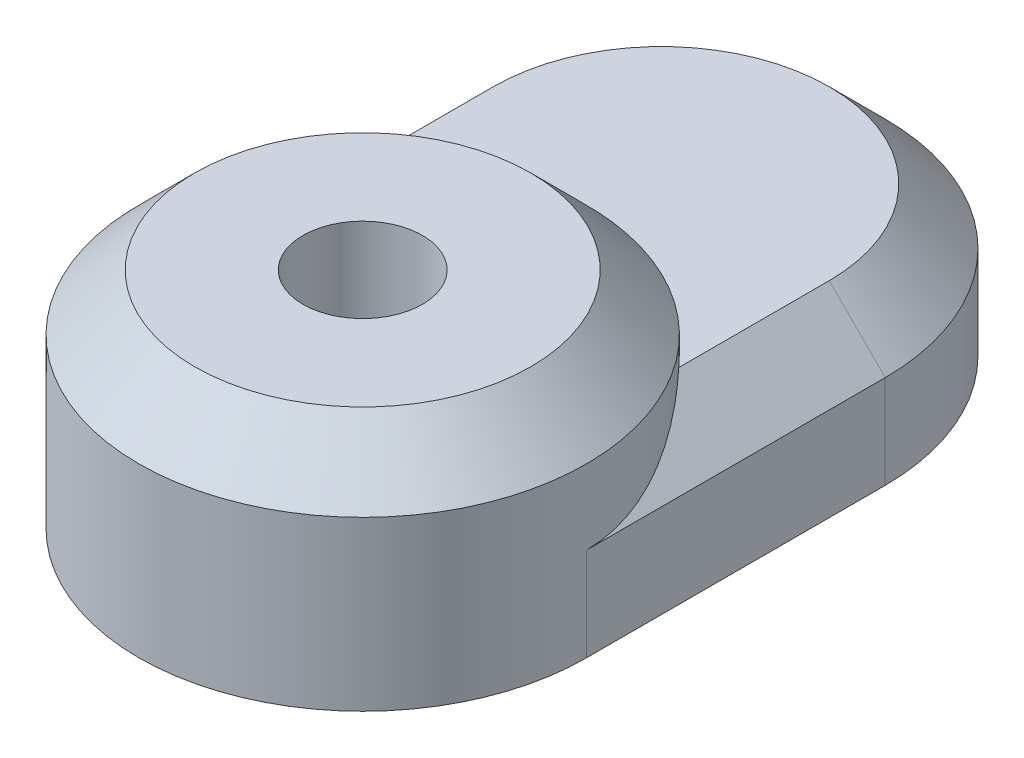
ISO-10303-21;
HEADER;
FILE_DESCRIPTION(('STEP AP214'),'2;1');
FILE_NAME('part.step','',(''),(''),'','','');
FILE_SCHEMA(('AUTOMOTIVE_DESIGN { 1 0 10303 214 1 1 1 1 }'));
ENDSEC;
DATA;
#1=APPLICATION_CONTEXT('core data for automotive mechanical design processes');
#2=APPLICATION_PROTOCOL_DEFINITION('international standard','automotive_design',2000,#1);
#3=PRODUCT_CONTEXT('',#1,'mechanical');
#4=PRODUCT('Part','Part','',(#3));
#5=PRODUCT_RELATED_PRODUCT_CATEGORY('part','',(#4));
#6=PRODUCT_DEFINITION_FORMATION('','',#4);
#7=PRODUCT_DEFINITION_CONTEXT('part definition',#1,'design');
#8=PRODUCT_DEFINITION('design','',#6,#7);
#9=PRODUCT_DEFINITION_SHAPE('','',#8);
#10=(LENGTH_UNIT() NAMED_UNIT(*) SI_UNIT(.MILLI.,.METRE.));
#11=(NAMED_UNIT(*) PLANE_ANGLE_UNIT() SI_UNIT($,.RADIAN.));
#12=(NAMED_UNIT(*) SI_UNIT($,.STERADIAN.) SOLID_ANGLE_UNIT());
#13=UNCERTAINTY_MEASURE_WITH_UNIT(LENGTH_MEASURE(1.E-05),#10,'distance_accuracy_value','');
#14=(GEOMETRIC_REPRESENTATION_CONTEXT(3) GLOBAL_UNCERTAINTY_ASSIGNED_CONTEXT((#13)) GLOBAL_UNIT_ASSIGNED_CONTEXT((#10,
#11,#12)) REPRESENTATION_CONTEXT('',''));
#15=CARTESIAN_POINT('',(0.,0.,0.));
#16=DIRECTION('',(0.,0.,1.));
#17=DIRECTION('',(1.,0.,0.));
#18=AXIS2_PLACEMENT_3D('',#15,#16,#17);
#19=CARTESIAN_POINT('',(0.,4.,0.));
#20=DIRECTION('',(0.,1.,0.));
#21=DIRECTION('',(0.,0.,1.));
#22=AXIS2_PLACEMENT_3D('',#19,#20,#21);
#23=PLANE('',#22);
#24=CARTESIAN_POINT('',(0.,4.,0.));
#25=DIRECTION('',(0.,1.,0.));
#26=DIRECTION('',(0.,0.,1.));
#27=AXIS2_PLACEMENT_3D('',#24,#25,#26);
#28=CIRCLE('',#27,6.);
#29=CARTESIAN_POINT('',(4.5,4.,-3.96862696659688));
#30=VERTEX_POINT('',#29);
#31=CARTESIAN_POINT('',(-4.5,4.,-3.96862696659688));
#32=VERTEX_POINT('',#31);
#33=EDGE_CURVE('E118',#30,#32,#28,.T.);
#34=ORIENTED_EDGE('',*,*,#33,.F.);
#35=DIRECTION('',(0.,0.,-1.));
#36=VECTOR('',#35,1.);
#37=CARTESIAN_POINT('',(4.5,4.,-8.));
#38=LINE('',#37,#36);
#39=CARTESIAN_POINT('',(4.5,4.,-8.));
#40=VERTEX_POINT('',#39);
#41=EDGE_CURVE('E152',#30,#40,#38,.T.);
#42=ORIENTED_EDGE('',*,*,#41,.T.);
#43=CARTESIAN_POINT('',(0.,4.,-8.));
#44=DIRECTION('',(0.,1.,0.));
#45=DIRECTION('',(0.,0.,1.));
#46=AXIS2_PLACEMENT_3D('',#43,#44,#45);
#47=CIRCLE('',#46,4.5);
#48=CARTESIAN_POINT('',(-4.5,4.,-8.));
#49=VERTEX_POINT('',#48);
#50=EDGE_CURVE('E148',#40,#49,#47,.T.);
#51=ORIENTED_EDGE('',*,*,#50,.T.);
#52=DIRECTION('',(0.,0.,1.));
#53=VECTOR('',#52,1.);
#54=CARTESIAN_POINT('',(-4.5,4.,0.));
#55=LINE('',#54,#53);
#56=EDGE_CURVE('E145',#49,#32,#55,.T.);
#57=ORIENTED_EDGE('',*,*,#56,.T.);
#58=EDGE_LOOP('',(#34,#42,#51,#57));
#59=FACE_BOUND('',#58,.T.);
#60=ADVANCED_FACE('F35',(#59),#23,.T.);
#61=CARTESIAN_POINT('',(0.,0.,0.));
#62=DIRECTION('',(0.,1.,0.));
#63=DIRECTION('',(0.,0.,1.));
#64=AXIS2_PLACEMENT_3D('',#61,#62,#63);
#65=PLANE('',#64);
#66=CARTESIAN_POINT('',(0.,0.,0.));
#67=DIRECTION('',(0.,1.,0.));
#68=DIRECTION('',(0.,0.,1.));
#69=AXIS2_PLACEMENT_3D('',#66,#67,#68);
#70=CIRCLE('',#69,6.);
#71=CARTESIAN_POINT('',(-6.,0.,0.));
#72=VERTEX_POINT('',#71);
#73=CARTESIAN_POINT('',(6.,0.,0.));
#74=VERTEX_POINT('',#73);
#75=EDGE_CURVE('E108',#72,#74,#70,.T.);
#76=ORIENTED_EDGE('',*,*,#75,.F.);
#77=DIRECTION('',(0.,0.,1.));
#78=VECTOR('',#77,1.);
#79=CARTESIAN_POINT('',(-6.,0.,0.));
#80=LINE('',#79,#78);
#81=CARTESIAN_POINT('',(-6.,0.,-8.));
#82=VERTEX_POINT('',#81);
#83=EDGE_CURVE('E123',#82,#72,#80,.T.);
#84=ORIENTED_EDGE('',*,*,#83,.F.);
#85=CARTESIAN_POINT('',(0.,0.,-8.));
#86=DIRECTION('',(0.,1.,0.));
#87=DIRECTION('',(0.,0.,1.));
#88=AXIS2_PLACEMENT_3D('',#85,#86,#87);
#89=CIRCLE('',#88,6.);
#90=CARTESIAN_POINT('',(6.,0.,-8.));
#91=VERTEX_POINT('',#90);
#92=EDGE_CURVE('E110',#91,#82,#89,.T.);
#93=ORIENTED_EDGE('',*,*,#92,.F.);
#94=DIRECTION('',(0.,0.,-1.));
#95=VECTOR('',#94,1.);
#96=CARTESIAN_POINT('',(6.,0.,0.));
#97=LINE('',#96,#95);
#98=EDGE_CURVE('E93',#74,#91,#97,.T.);
#99=ORIENTED_EDGE('',*,*,#98,.F.);
#100=EDGE_LOOP('',(#76,#84,#93,#99));
#101=FACE_BOUND('',#100,.T.);
#102=CARTESIAN_POINT('',(0.,0.,0.));
#103=DIRECTION('',(0.,1.,0.));
#104=DIRECTION('',(0.,0.,1.));
#105=AXIS2_PLACEMENT_3D('',#102,#103,#104);
#106=CIRCLE('',#105,1.6);
#107=CARTESIAN_POINT('',(0.,0.,1.6));
#108=VERTEX_POINT('',#107);
#109=EDGE_CURVE('E115',#108,#108,#106,.T.);
#110=ORIENTED_EDGE('',*,*,#109,.T.);
#111=EDGE_LOOP('',(#110));
#112=FACE_BOUND('',#111,.T.);
#113=ADVANCED_FACE('F105',(#101,#112),#65,.F.);
#114=CARTESIAN_POINT('',(0.,4.,0.));
#115=DIRECTION('',(0.,-1.,0.));
#116=DIRECTION('',(0.,0.,-1.));
#117=AXIS2_PLACEMENT_3D('',#114,#115,#116);
#118=CYLINDRICAL_SURFACE('',#117,6.);
#119=CARTESIAN_POINT('',(0.,4.5,0.));
#120=DIRECTION('',(0.,1.,0.));
#121=DIRECTION('',(0.,0.,1.));
#122=AXIS2_PLACEMENT_3D('',#119,#120,#121);
#123=CIRCLE('',#122,6.);
#124=CARTESIAN_POINT('',(0.,4.5,6.));
#125=VERTEX_POINT('',#124);
#126=EDGE_CURVE('E138',#125,#125,#123,.F.);
#127=ORIENTED_EDGE('',*,*,#126,.T.);
#128=EDGE_LOOP('',(#127));
#129=FACE_BOUND('',#128,.T.);
#130=ORIENTED_EDGE('',*,*,#75,.T.);
#131=DIRECTION('',(0.,-1.,0.));
#132=VECTOR('',#131,1.);
#133=CARTESIAN_POINT('',(6.,4.,0.));
#134=LINE('',#133,#132);
#135=CARTESIAN_POINT('',(6.,2.5,0.));
#136=VERTEX_POINT('',#135);
#137=EDGE_CURVE('E90',#136,#74,#134,.T.);
#138=ORIENTED_EDGE('',*,*,#137,.F.);
#139=CARTESIAN_POINT('',(0.,8.50000000000002,0.));
#140=DIRECTION('',(0.707106781186549,0.707106781186546,0.));
#141=DIRECTION('',(0.707106781186546,-0.707106781186549,0.));
#142=AXIS2_PLACEMENT_3D('',#139,#140,#141);
#143=ELLIPSE('',#142,8.48528137423859,6.);
#144=EDGE_CURVE('E44',#136,#30,#143,.T.);
#145=ORIENTED_EDGE('',*,*,#144,.T.);
#146=ORIENTED_EDGE('',*,*,#33,.T.);
#147=CARTESIAN_POINT('',(0.,8.50000000000002,0.));
#148=DIRECTION('',(-0.707106781186549,0.707106781186546,0.));
#149=DIRECTION('',(-0.707106781186546,-0.707106781186549,0.));
#150=AXIS2_PLACEMENT_3D('',#147,#148,#149);
#151=ELLIPSE('',#150,8.48528137423859,6.);
#152=CARTESIAN_POINT('',(-6.,2.5,0.));
#153=VERTEX_POINT('',#152);
#154=EDGE_CURVE('E11',#32,#153,#151,.T.);
#155=ORIENTED_EDGE('',*,*,#154,.T.);
#156=DIRECTION('',(0.,-1.,0.));
#157=VECTOR('',#156,1.);
#158=CARTESIAN_POINT('',(-6.,4.,0.));
#159=LINE('',#158,#157);
#160=EDGE_CURVE('E113',#153,#72,#159,.T.);
#161=ORIENTED_EDGE('',*,*,#160,.T.);
#162=EDGE_LOOP('',(#130,#138,#145,#146,#155,#161));
#163=FACE_BOUND('',#162,.T.);
#164=ADVANCED_FACE('F112',(#129,#163),#118,.T.);
#165=CARTESIAN_POINT('',(6.,4.,0.));
#166=DIRECTION('',(-1.,0.,0.));
#167=DIRECTION('',(0.,0.,1.));
#168=AXIS2_PLACEMENT_3D('',#165,#166,#167);
#169=PLANE('',#168);
#170=DIRECTION('',(0.,-1.,0.));
#171=VECTOR('',#170,1.);
#172=CARTESIAN_POINT('',(6.,4.,-8.));
#173=LINE('',#172,#171);
#174=CARTESIAN_POINT('',(6.,2.5,-8.));
#175=VERTEX_POINT('',#174);
#176=EDGE_CURVE('E101',#175,#91,#173,.T.);
#177=ORIENTED_EDGE('',*,*,#176,.F.);
#178=DIRECTION('',(0.,0.,1.));
#179=VECTOR('',#178,1.);
#180=CARTESIAN_POINT('',(6.,2.5,0.));
#181=LINE('',#180,#179);
#182=EDGE_CURVE('E96',#175,#136,#181,.T.);
#183=ORIENTED_EDGE('',*,*,#182,.T.);
#184=ORIENTED_EDGE('',*,*,#137,.T.);
#185=ORIENTED_EDGE('',*,*,#98,.T.);
#186=EDGE_LOOP('',(#177,#183,#184,#185));
#187=FACE_BOUND('',#186,.T.);
#188=ADVANCED_FACE('F92',(#187),#169,.F.);
#189=CARTESIAN_POINT('',(0.,4.,-8.));
#190=DIRECTION('',(0.,-1.,0.));
#191=DIRECTION('',(0.,0.,-1.));
#192=AXIS2_PLACEMENT_3D('',#189,#190,#191);
#193=CYLINDRICAL_SURFACE('',#192,6.);
#194=DIRECTION('',(0.,-1.,0.));
#195=VECTOR('',#194,1.);
#196=CARTESIAN_POINT('',(-6.,4.,-8.));
#197=LINE('',#196,#195);
#198=CARTESIAN_POINT('',(-6.,2.5,-8.));
#199=VERTEX_POINT('',#198);
#200=EDGE_CURVE('E125',#199,#82,#197,.T.);
#201=ORIENTED_EDGE('',*,*,#200,.F.);
#202=CARTESIAN_POINT('',(0.,2.5,-8.));
#203=DIRECTION('',(0.,1.,0.));
#204=DIRECTION('',(0.,0.,1.));
#205=AXIS2_PLACEMENT_3D('',#202,#203,#204);
#206=CIRCLE('',#205,6.);
#207=EDGE_CURVE('E59',#199,#175,#206,.F.);
#208=ORIENTED_EDGE('',*,*,#207,.T.);
#209=ORIENTED_EDGE('',*,*,#176,.T.);
#210=ORIENTED_EDGE('',*,*,#92,.T.);
#211=EDGE_LOOP('',(#201,#208,#209,#210));
#212=FACE_BOUND('',#211,.T.);
#213=ADVANCED_FACE('F195',(#212),#193,.T.);
#214=CARTESIAN_POINT('',(-6.,4.,0.));
#215=DIRECTION('',(1.,0.,0.));
#216=DIRECTION('',(0.,0.,-1.));
#217=AXIS2_PLACEMENT_3D('',#214,#215,#216);
#218=PLANE('',#217);
#219=ORIENTED_EDGE('',*,*,#160,.F.);
#220=DIRECTION('',(0.,0.,-1.));
#221=VECTOR('',#220,1.);
#222=CARTESIAN_POINT('',(-6.,2.5,-8.));
#223=LINE('',#222,#221);
#224=EDGE_CURVE('E52',#153,#199,#223,.T.);
#225=ORIENTED_EDGE('',*,*,#224,.T.);
#226=ORIENTED_EDGE('',*,*,#200,.T.);
#227=ORIENTED_EDGE('',*,*,#83,.T.);
#228=EDGE_LOOP('',(#219,#225,#226,#227));
#229=FACE_BOUND('',#228,.T.);
#230=ADVANCED_FACE('F183',(#229),#218,.F.);
#231=CARTESIAN_POINT('',(0.,4.,0.));
#232=DIRECTION('',(0.,-1.,0.));
#233=DIRECTION('',(0.,0.,-1.));
#234=AXIS2_PLACEMENT_3D('',#231,#232,#233);
#235=CYLINDRICAL_SURFACE('',#234,1.6);
#236=ORIENTED_EDGE('',*,*,#109,.F.);
#237=EDGE_LOOP('',(#236));
#238=FACE_BOUND('',#237,.T.);
#239=CARTESIAN_POINT('',(0.,6.,0.));
#240=DIRECTION('',(0.,1.,0.));
#241=DIRECTION('',(0.,0.,1.));
#242=AXIS2_PLACEMENT_3D('',#239,#240,#241);
#243=CIRCLE('',#242,1.6);
#244=CARTESIAN_POINT('',(0.,6.,1.6));
#245=VERTEX_POINT('',#244);
#246=EDGE_CURVE('E135',#245,#245,#243,.T.);
#247=ORIENTED_EDGE('',*,*,#246,.T.);
#248=EDGE_LOOP('',(#247));
#249=FACE_BOUND('',#248,.T.);
#250=ADVANCED_FACE('F171',(#238,#249),#235,.F.);
#251=CARTESIAN_POINT('',(0.,6.,0.));
#252=DIRECTION('',(0.,1.,0.));
#253=DIRECTION('',(0.,0.,1.));
#254=AXIS2_PLACEMENT_3D('',#251,#252,#253);
#255=PLANE('',#254);
#256=CARTESIAN_POINT('',(0.,6.,0.));
#257=DIRECTION('',(0.,1.,0.));
#258=DIRECTION('',(0.,0.,1.));
#259=AXIS2_PLACEMENT_3D('',#256,#257,#258);
#260=CIRCLE('',#259,4.50000000000001);
#261=CARTESIAN_POINT('',(0.,6.,4.50000000000001));
#262=VERTEX_POINT('',#261);
#263=EDGE_CURVE('E100',#262,#262,#260,.T.);
#264=ORIENTED_EDGE('',*,*,#263,.T.);
#265=EDGE_LOOP('',(#264));
#266=FACE_BOUND('',#265,.T.);
#267=ORIENTED_EDGE('',*,*,#246,.F.);
#268=EDGE_LOOP('',(#267));
#269=FACE_BOUND('',#268,.T.);
#270=ADVANCED_FACE('F173',(#266,#269),#255,.T.);
#271=CARTESIAN_POINT('',(0.,6.,0.));
#272=DIRECTION('',(0.,-1.,0.));
#273=DIRECTION('',(0.,0.,-1.));
#274=AXIS2_PLACEMENT_3D('',#271,#272,#273);
#275=CONICAL_SURFACE('',#274,4.50000000000001,0.785398163397446);
#276=ORIENTED_EDGE('',*,*,#126,.F.);
#277=EDGE_LOOP('',(#276));
#278=FACE_BOUND('',#277,.T.);
#279=ORIENTED_EDGE('',*,*,#263,.F.);
#280=EDGE_LOOP('',(#279));
#281=FACE_BOUND('',#280,.T.);
#282=ADVANCED_FACE('F175',(#278,#281),#275,.T.);
#283=CARTESIAN_POINT('',(-4.5,4.,0.));
#284=DIRECTION('',(-0.707106781186549,0.707106781186546,0.));
#285=DIRECTION('',(0.,0.,-1.));
#286=AXIS2_PLACEMENT_3D('',#283,#284,#285);
#287=PLANE('',#286);
#288=ORIENTED_EDGE('',*,*,#154,.F.);
#289=ORIENTED_EDGE('',*,*,#56,.F.);
#290=DIRECTION('',(0.707106781186546,0.707106781186549,0.));
#291=VECTOR('',#290,1.);
#292=CARTESIAN_POINT('',(-6.,2.5,-8.));
#293=LINE('',#292,#291);
#294=EDGE_CURVE('E39',#199,#49,#293,.T.);
#295=ORIENTED_EDGE('',*,*,#294,.F.);
#296=ORIENTED_EDGE('',*,*,#224,.F.);
#297=EDGE_LOOP('',(#288,#289,#295,#296));
#298=FACE_BOUND('',#297,.T.);
#299=ADVANCED_FACE('F37',(#298),#287,.T.);
#300=CARTESIAN_POINT('',(0.,4.,-8.));
#301=DIRECTION('',(0.,-1.,0.));
#302=DIRECTION('',(0.,0.,-1.));
#303=AXIS2_PLACEMENT_3D('',#300,#301,#302);
#304=CONICAL_SURFACE('',#303,4.5,0.785398163397446);
#305=ORIENTED_EDGE('',*,*,#294,.T.);
#306=ORIENTED_EDGE('',*,*,#50,.F.);
#307=DIRECTION('',(-0.707106781186546,0.707106781186549,0.));
#308=VECTOR('',#307,1.);
#309=CARTESIAN_POINT('',(6.,2.5,-8.));
#310=LINE('',#309,#308);
#311=EDGE_CURVE('E160',#175,#40,#310,.T.);
#312=ORIENTED_EDGE('',*,*,#311,.F.);
#313=ORIENTED_EDGE('',*,*,#207,.F.);
#314=EDGE_LOOP('',(#305,#306,#312,#313));
#315=FACE_BOUND('',#314,.T.);
#316=ADVANCED_FACE('F204',(#315),#304,.T.);
#317=CARTESIAN_POINT('',(4.5,4.,0.));
#318=DIRECTION('',(0.707106781186549,0.707106781186546,0.));
#319=DIRECTION('',(0.,0.,1.));
#320=AXIS2_PLACEMENT_3D('',#317,#318,#319);
#321=PLANE('',#320);
#322=ORIENTED_EDGE('',*,*,#144,.F.);
#323=ORIENTED_EDGE('',*,*,#182,.F.);
#324=ORIENTED_EDGE('',*,*,#311,.T.);
#325=ORIENTED_EDGE('',*,*,#41,.F.);
#326=EDGE_LOOP('',(#322,#323,#324,#325));
#327=FACE_BOUND('',#326,.T.);
#328=ADVANCED_FACE('F202',(#327),#321,.T.);
#329=CLOSED_SHELL('',(#60,#113,#164,#188,#213,#230,#250,#270,#282,#299,#316,#328));
#330=MANIFOLD_SOLID_BREP('B2',#329);
#331=ADVANCED_BREP_SHAPE_REPRESENTATION('',(#18,#330),#14);
#332=SHAPE_DEFINITION_REPRESENTATION(#9,#331);
ENDSEC;
END-ISO-10303-21;
